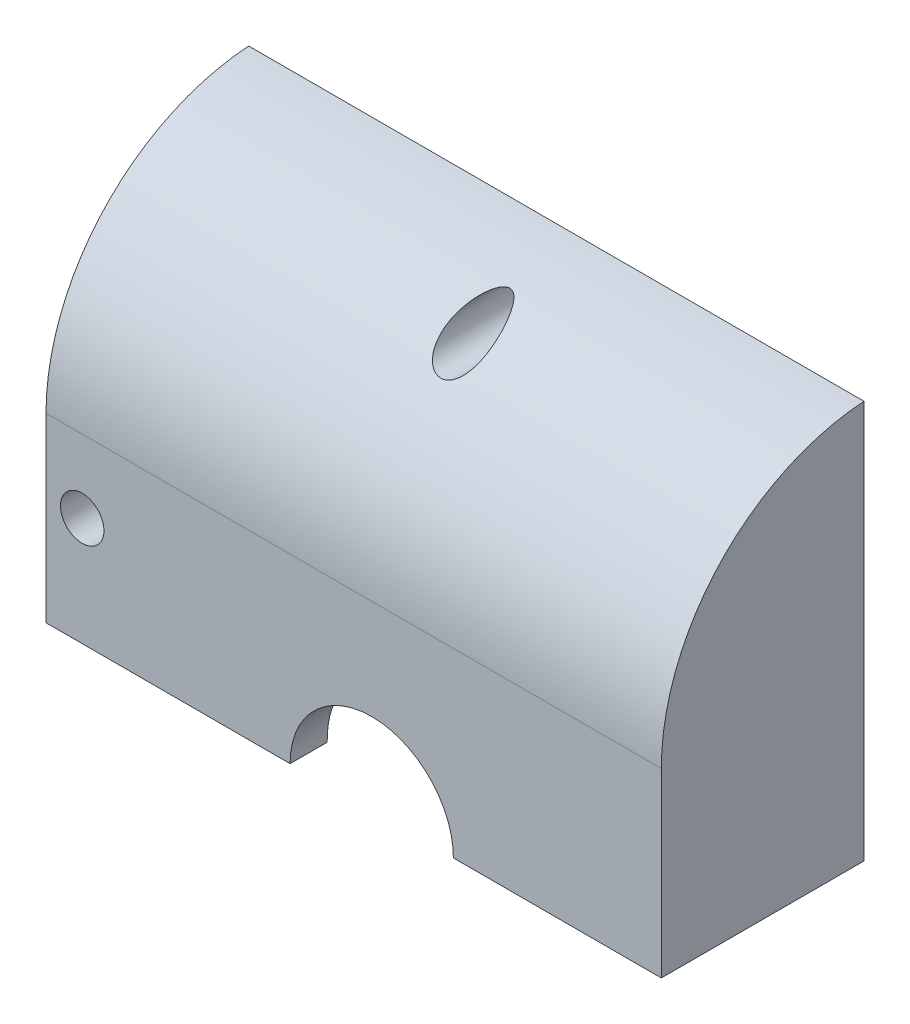
ISO-10303-21;
HEADER;
FILE_DESCRIPTION(('STEP AP214'),'2;1');
FILE_NAME('part.step','',(''),(''),'','','');
FILE_SCHEMA(('AUTOMOTIVE_DESIGN { 1 0 10303 214 1 1 1 1 }'));
ENDSEC;
DATA;
#1=APPLICATION_CONTEXT('core data for automotive mechanical design processes');
#2=APPLICATION_PROTOCOL_DEFINITION('international standard','automotive_design',2000,#1);
#3=PRODUCT_CONTEXT('',#1,'mechanical');
#4=PRODUCT('Part','Part','',(#3));
#5=PRODUCT_RELATED_PRODUCT_CATEGORY('part','',(#4));
#6=PRODUCT_DEFINITION_FORMATION('','',#4);
#7=PRODUCT_DEFINITION_CONTEXT('part definition',#1,'design');
#8=PRODUCT_DEFINITION('design','',#6,#7);
#9=PRODUCT_DEFINITION_SHAPE('','',#8);
#10=(LENGTH_UNIT() NAMED_UNIT(*) SI_UNIT(.MILLI.,.METRE.));
#11=(NAMED_UNIT(*) PLANE_ANGLE_UNIT() SI_UNIT($,.RADIAN.));
#12=(NAMED_UNIT(*) SI_UNIT($,.STERADIAN.) SOLID_ANGLE_UNIT());
#13=UNCERTAINTY_MEASURE_WITH_UNIT(LENGTH_MEASURE(1.E-05),#10,'distance_accuracy_value','');
#14=(GEOMETRIC_REPRESENTATION_CONTEXT(3) GLOBAL_UNCERTAINTY_ASSIGNED_CONTEXT((#13)) GLOBAL_UNIT_ASSIGNED_CONTEXT((#10,
#11,#12)) REPRESENTATION_CONTEXT('',''));
#15=CARTESIAN_POINT('',(0.,0.,0.));
#16=DIRECTION('',(0.,0.,1.));
#17=DIRECTION('',(1.,0.,0.));
#18=AXIS2_PLACEMENT_3D('',#15,#16,#17);
#19=CARTESIAN_POINT('',(0.,0.,25.5));
#20=DIRECTION('',(0.,0.,-1.));
#21=DIRECTION('',(-1.,0.,0.));
#22=AXIS2_PLACEMENT_3D('',#19,#20,#21);
#23=PLANE('',#22);
#24=CARTESIAN_POINT('',(45.0002335495647,55.0002335495648,25.5));
#25=DIRECTION('',(0.,0.,-1.));
#26=DIRECTION('',(-1.,0.,0.));
#27=AXIS2_PLACEMENT_3D('',#24,#25,#26);
#28=CIRCLE('',#27,11.28);
#29=CARTESIAN_POINT('',(40.9202335495647,65.516506653664,25.5));
#30=VERTEX_POINT('',#29);
#31=CARTESIAN_POINT('',(42.8830772732052,66.0797664504352,25.5));
#32=VERTEX_POINT('',#31);
#33=EDGE_CURVE('E325',#30,#32,#28,.T.);
#34=ORIENTED_EDGE('',*,*,#33,.F.);
#35=DIRECTION('',(0.,1.,0.));
#36=VECTOR('',#35,1.);
#37=CARTESIAN_POINT('',(40.9202335495647,0.,25.5));
#38=LINE('',#37,#36);
#39=CARTESIAN_POINT('',(40.9202335495647,66.0797664504352,25.5));
#40=VERTEX_POINT('',#39);
#41=EDGE_CURVE('E239',#30,#40,#38,.T.);
#42=ORIENTED_EDGE('',*,*,#41,.T.);
#43=DIRECTION('',(1.,0.,0.));
#44=VECTOR('',#43,1.);
#45=CARTESIAN_POINT('',(0.,66.0797664504352,25.5));
#46=LINE('',#45,#44);
#47=EDGE_CURVE('E240',#40,#32,#46,.T.);
#48=ORIENTED_EDGE('',*,*,#47,.T.);
#49=EDGE_LOOP('',(#34,#42,#48));
#50=FACE_BOUND('',#49,.T.);
#51=ADVANCED_FACE('F38',(#50),#23,.T.);
#52=CARTESIAN_POINT('',(47.1173898259243,66.0797664504352,25.5));
#53=VERTEX_POINT('',#52);
#54=CARTESIAN_POINT('',(49.0797664504352,65.5166878622462,25.5));
#55=VERTEX_POINT('',#54);
#56=EDGE_CURVE('E309',#53,#55,#28,.T.);
#57=ORIENTED_EDGE('',*,*,#56,.F.);
#58=CARTESIAN_POINT('',(49.0797664504352,66.0797664504352,25.5));
#59=VERTEX_POINT('',#58);
#60=EDGE_CURVE('E229',#53,#59,#46,.T.);
#61=ORIENTED_EDGE('',*,*,#60,.T.);
#62=DIRECTION('',(0.,-1.,0.));
#63=VECTOR('',#62,1.);
#64=CARTESIAN_POINT('',(49.0797664504352,0.,25.5));
#65=LINE('',#64,#63);
#66=EDGE_CURVE('E244',#59,#55,#65,.T.);
#67=ORIENTED_EDGE('',*,*,#66,.T.);
#68=EDGE_LOOP('',(#57,#61,#67));
#69=FACE_BOUND('',#68,.T.);
#70=ADVANCED_FACE('F361',(#69),#23,.T.);
#71=CARTESIAN_POINT('',(0.,0.,0.));
#72=DIRECTION('',(0.,0.,-1.));
#73=DIRECTION('',(-1.,0.,0.));
#74=AXIS2_PLACEMENT_3D('',#71,#72,#73);
#75=PLANE('',#74);
#76=DIRECTION('',(0.,1.,0.));
#77=VECTOR('',#76,1.);
#78=CARTESIAN_POINT('',(85.,55.,0.));
#79=LINE('',#78,#77);
#80=CARTESIAN_POINT('',(85.,55.,0.));
#81=VERTEX_POINT('',#80);
#82=CARTESIAN_POINT('',(85.,110.,0.));
#83=VERTEX_POINT('',#82);
#84=EDGE_CURVE('E164',#81,#83,#79,.T.);
#85=ORIENTED_EDGE('',*,*,#84,.F.);
#86=DIRECTION('',(1.,0.,0.));
#87=VECTOR('',#86,1.);
#88=CARTESIAN_POINT('',(90.,55.,0.));
#89=LINE('',#88,#87);
#90=CARTESIAN_POINT('',(77.8290960636936,55.,0.));
#91=VERTEX_POINT('',#90);
#92=EDGE_CURVE('E178',#91,#81,#89,.T.);
#93=ORIENTED_EDGE('',*,*,#92,.F.);
#94=DIRECTION('',(0.,1.,0.));
#95=VECTOR('',#94,1.);
#96=CARTESIAN_POINT('',(77.8290960636935,0.,0.));
#97=LINE('',#96,#95);
#98=CARTESIAN_POINT('',(77.8290960636935,75.5105795379122,0.));
#99=VERTEX_POINT('',#98);
#100=EDGE_CURVE('E260',#99,#91,#97,.F.);
#101=ORIENTED_EDGE('',*,*,#100,.F.);
#102=CARTESIAN_POINT('',(57.1235724554919,74.1235724554919,0.));
#103=DIRECTION('',(0.,0.,-1.));
#104=DIRECTION('',(-0.707106781186548,-0.707106781186548,0.));
#105=AXIS2_PLACEMENT_3D('',#102,#103,#104);
#106=ELLIPSE('',#105,21.3877866030965,20.);
#107=CARTESIAN_POINT('',(58.5105795379122,94.8290960636936,0.));
#108=VERTEX_POINT('',#107);
#109=EDGE_CURVE('E437',#99,#108,#106,.F.);
#110=ORIENTED_EDGE('',*,*,#109,.T.);
#111=DIRECTION('',(-1.,0.,0.));
#112=VECTOR('',#111,1.);
#113=CARTESIAN_POINT('',(0.,94.8290960636936,0.));
#114=LINE('',#113,#112);
#115=CARTESIAN_POINT('',(31.4894204620877,94.8290960636936,0.));
#116=VERTEX_POINT('',#115);
#117=EDGE_CURVE('E266',#116,#108,#114,.F.);
#118=ORIENTED_EDGE('',*,*,#117,.F.);
#119=CARTESIAN_POINT('',(32.876427544508,74.123572455492,0.));
#120=DIRECTION('',(0.,0.,-1.));
#121=DIRECTION('',(0.707106781186548,-0.707106781186548,0.));
#122=AXIS2_PLACEMENT_3D('',#119,#120,#121);
#123=ELLIPSE('',#122,21.3877866030965,20.);
#124=CARTESIAN_POINT('',(12.1709039363064,75.5105795379122,0.));
#125=VERTEX_POINT('',#124);
#126=EDGE_CURVE('E443',#116,#125,#123,.F.);
#127=ORIENTED_EDGE('',*,*,#126,.T.);
#128=DIRECTION('',(0.,-1.,0.));
#129=VECTOR('',#128,1.);
#130=CARTESIAN_POINT('',(12.1709039363064,0.,0.));
#131=LINE('',#130,#129);
#132=CARTESIAN_POINT('',(12.1709039363064,58.5,0.));
#133=VERTEX_POINT('',#132);
#134=EDGE_CURVE('E263',#133,#125,#131,.F.);
#135=ORIENTED_EDGE('',*,*,#134,.F.);
#136=DIRECTION('',(-1.,0.,0.));
#137=VECTOR('',#136,1.);
#138=CARTESIAN_POINT('',(12.1709039363064,58.5,0.));
#139=LINE('',#138,#137);
#140=CARTESIAN_POINT('',(0.,58.5,0.));
#141=VERTEX_POINT('',#140);
#142=EDGE_CURVE('E194',#133,#141,#139,.T.);
#143=ORIENTED_EDGE('',*,*,#142,.T.);
#144=DIRECTION('',(0.,-1.,0.));
#145=VECTOR('',#144,1.);
#146=CARTESIAN_POINT('',(0.,0.,0.));
#147=LINE('',#146,#145);
#148=CARTESIAN_POINT('',(0.,110.,0.));
#149=VERTEX_POINT('',#148);
#150=EDGE_CURVE('E287',#149,#141,#147,.T.);
#151=ORIENTED_EDGE('',*,*,#150,.F.);
#152=DIRECTION('',(-1.,0.,0.));
#153=VECTOR('',#152,1.);
#154=CARTESIAN_POINT('',(0.,110.,0.));
#155=LINE('',#154,#153);
#156=EDGE_CURVE('E181',#83,#149,#155,.T.);
#157=ORIENTED_EDGE('',*,*,#156,.F.);
#158=EDGE_LOOP('',(#85,#93,#101,#110,#118,#127,#135,#143,#151,#157));
#159=FACE_BOUND('',#158,.T.);
#160=CARTESIAN_POINT('',(45.,105.,0.));
#161=DIRECTION('',(0.,0.,-1.));
#162=DIRECTION('',(-1.,0.,0.));
#163=AXIS2_PLACEMENT_3D('',#160,#161,#162);
#164=CIRCLE('',#163,1.5);
#165=CARTESIAN_POINT('',(43.5,105.,0.));
#166=VERTEX_POINT('',#165);
#167=EDGE_CURVE('E283',#166,#166,#164,.T.);
#168=ORIENTED_EDGE('',*,*,#167,.F.);
#169=EDGE_LOOP('',(#168));
#170=FACE_BOUND('',#169,.T.);
#171=CARTESIAN_POINT('',(4.99999999999999,70.,0.));
#172=DIRECTION('',(0.,0.,-1.));
#173=DIRECTION('',(-1.,0.,0.));
#174=AXIS2_PLACEMENT_3D('',#171,#172,#173);
#175=CIRCLE('',#174,1.5);
#176=CARTESIAN_POINT('',(3.49999999999999,70.,0.));
#177=VERTEX_POINT('',#176);
#178=EDGE_CURVE('E288',#177,#177,#175,.T.);
#179=ORIENTED_EDGE('',*,*,#178,.F.);
#180=EDGE_LOOP('',(#179));
#181=FACE_BOUND('',#180,.T.);
#182=ADVANCED_FACE('F175',(#159,#170,#181),#75,.T.);
#183=CARTESIAN_POINT('',(45.,105.,28.));
#184=DIRECTION('',(0.,0.,-1.));
#185=DIRECTION('',(-1.,0.,0.));
#186=AXIS2_PLACEMENT_3D('',#183,#184,#185);
#187=CYLINDRICAL_SURFACE('',#186,1.5);
#188=ORIENTED_EDGE('',*,*,#167,.T.);
#189=EDGE_LOOP('',(#188));
#190=FACE_BOUND('',#189,.T.);
#191=CARTESIAN_POINT('',(45.,105.,2.));
#192=DIRECTION('',(0.,0.,1.));
#193=DIRECTION('',(1.,0.,0.));
#194=AXIS2_PLACEMENT_3D('',#191,#192,#193);
#195=CIRCLE('',#194,1.5);
#196=CARTESIAN_POINT('',(46.5,105.,2.));
#197=VERTEX_POINT('',#196);
#198=EDGE_CURVE('E313',#197,#197,#195,.F.);
#199=ORIENTED_EDGE('',*,*,#198,.F.);
#200=EDGE_LOOP('',(#199));
#201=FACE_BOUND('',#200,.T.);
#202=ADVANCED_FACE('F347',(#190,#201),#187,.F.);
#203=CARTESIAN_POINT('',(4.99999999999999,70.,28.));
#204=DIRECTION('',(0.,0.,-1.));
#205=DIRECTION('',(-1.,0.,0.));
#206=AXIS2_PLACEMENT_3D('',#203,#204,#205);
#207=CYLINDRICAL_SURFACE('',#206,1.5);
#208=ORIENTED_EDGE('',*,*,#178,.T.);
#209=EDGE_LOOP('',(#208));
#210=FACE_BOUND('',#209,.T.);
#211=CARTESIAN_POINT('',(4.99999999999999,70.,2.));
#212=DIRECTION('',(0.,0.,1.));
#213=DIRECTION('',(1.,0.,0.));
#214=AXIS2_PLACEMENT_3D('',#211,#212,#213);
#215=CIRCLE('',#214,1.5);
#216=CARTESIAN_POINT('',(6.49999999999999,70.,2.));
#217=VERTEX_POINT('',#216);
#218=EDGE_CURVE('E275',#217,#217,#215,.F.);
#219=ORIENTED_EDGE('',*,*,#218,.F.);
#220=EDGE_LOOP('',(#219));
#221=FACE_BOUND('',#220,.T.);
#222=ADVANCED_FACE('F350',(#210,#221),#207,.F.);
#223=CARTESIAN_POINT('',(0.,0.,28.));
#224=DIRECTION('',(1.,0.,0.));
#225=DIRECTION('',(0.,1.,0.));
#226=AXIS2_PLACEMENT_3D('',#223,#224,#225);
#227=PLANE('',#226);
#228=DIRECTION('',(0.,0.,-1.));
#229=VECTOR('',#228,1.);
#230=CARTESIAN_POINT('',(0.,58.5,6.5));
#231=LINE('',#230,#229);
#232=CARTESIAN_POINT('',(0.,58.5,6.5));
#233=VERTEX_POINT('',#232);
#234=EDGE_CURVE('E463',#233,#141,#231,.T.);
#235=ORIENTED_EDGE('',*,*,#234,.F.);
#236=CARTESIAN_POINT('',(0.,55.,6.5));
#237=DIRECTION('',(-1.,0.,0.));
#238=DIRECTION('',(0.,-1.,0.));
#239=AXIS2_PLACEMENT_3D('',#236,#237,#238);
#240=CIRCLE('',#239,3.5);
#241=CARTESIAN_POINT('',(0.,55.,10.));
#242=VERTEX_POINT('',#241);
#243=EDGE_CURVE('E462',#242,#233,#240,.T.);
#244=ORIENTED_EDGE('',*,*,#243,.F.);
#245=DIRECTION('',(0.,0.,-1.));
#246=VECTOR('',#245,1.);
#247=CARTESIAN_POINT('',(0.,55.,28.));
#248=LINE('',#247,#246);
#249=CARTESIAN_POINT('',(0.,55.,28.));
#250=VERTEX_POINT('',#249);
#251=EDGE_CURVE('E197',#250,#242,#248,.T.);
#252=ORIENTED_EDGE('',*,*,#251,.F.);
#253=DIRECTION('',(0.,-1.,0.));
#254=VECTOR('',#253,1.);
#255=CARTESIAN_POINT('',(0.,0.,28.));
#256=LINE('',#255,#254);
#257=CARTESIAN_POINT('',(0.,80.0667409058085,28.));
#258=VERTEX_POINT('',#257);
#259=EDGE_CURVE('E293',#258,#250,#256,.T.);
#260=ORIENTED_EDGE('',*,*,#259,.F.);
#261=CARTESIAN_POINT('',(0.,80.0667409058085,-2.));
#262=DIRECTION('',(1.,0.,0.));
#263=DIRECTION('',(0.,1.,0.));
#264=AXIS2_PLACEMENT_3D('',#261,#262,#263);
#265=CIRCLE('',#264,30.);
#266=EDGE_CURVE('E305',#258,#149,#265,.F.);
#267=ORIENTED_EDGE('',*,*,#266,.T.);
#268=ORIENTED_EDGE('',*,*,#150,.T.);
#269=EDGE_LOOP('',(#235,#244,#252,#260,#267,#268));
#270=FACE_BOUND('',#269,.T.);
#271=ADVANCED_FACE('F354',(#270),#227,.F.);
#272=CARTESIAN_POINT('',(0.,0.,28.));
#273=DIRECTION('',(0.,0.,-1.));
#274=DIRECTION('',(-1.,0.,0.));
#275=AXIS2_PLACEMENT_3D('',#272,#273,#274);
#276=PLANE('',#275);
#277=DIRECTION('',(1.,0.,0.));
#278=VECTOR('',#277,1.);
#279=CARTESIAN_POINT('',(90.,55.,28.));
#280=LINE('',#279,#278);
#281=CARTESIAN_POINT('',(56.2802335471469,55.,28.));
#282=VERTEX_POINT('',#281);
#283=CARTESIAN_POINT('',(85.,55.,28.));
#284=VERTEX_POINT('',#283);
#285=EDGE_CURVE('E188',#282,#284,#280,.T.);
#286=ORIENTED_EDGE('',*,*,#285,.T.);
#287=DIRECTION('',(0.,1.,0.));
#288=VECTOR('',#287,1.);
#289=CARTESIAN_POINT('',(85.,55.,28.));
#290=LINE('',#289,#288);
#291=CARTESIAN_POINT('',(85.,80.0667409058085,28.));
#292=VERTEX_POINT('',#291);
#293=EDGE_CURVE('E54',#284,#292,#290,.T.);
#294=ORIENTED_EDGE('',*,*,#293,.T.);
#295=DIRECTION('',(1.,0.,0.));
#296=VECTOR('',#295,1.);
#297=CARTESIAN_POINT('',(0.,80.0667409058085,28.));
#298=LINE('',#297,#296);
#299=EDGE_CURVE('E297',#292,#258,#298,.F.);
#300=ORIENTED_EDGE('',*,*,#299,.T.);
#301=ORIENTED_EDGE('',*,*,#259,.T.);
#302=CARTESIAN_POINT('',(33.7202335519825,55.,28.));
#303=VERTEX_POINT('',#302);
#304=EDGE_CURVE('E192',#250,#303,#280,.T.);
#305=ORIENTED_EDGE('',*,*,#304,.T.);
#306=CARTESIAN_POINT('',(45.0002335495647,55.0002335495648,28.));
#307=DIRECTION('',(0.,0.,-1.));
#308=DIRECTION('',(-1.,0.,0.));
#309=AXIS2_PLACEMENT_3D('',#306,#307,#308);
#310=CIRCLE('',#309,11.28);
#311=EDGE_CURVE('E225',#303,#282,#310,.T.);
#312=ORIENTED_EDGE('',*,*,#311,.T.);
#313=EDGE_LOOP('',(#286,#294,#300,#301,#305,#312));
#314=FACE_BOUND('',#313,.T.);
#315=CARTESIAN_POINT('',(4.99999999999999,70.,28.));
#316=DIRECTION('',(0.,0.,1.));
#317=DIRECTION('',(1.,0.,0.));
#318=AXIS2_PLACEMENT_3D('',#315,#316,#317);
#319=CIRCLE('',#318,3.);
#320=CARTESIAN_POINT('',(7.99999999999999,70.,28.));
#321=VERTEX_POINT('',#320);
#322=EDGE_CURVE('E270',#321,#321,#319,.T.);
#323=ORIENTED_EDGE('',*,*,#322,.F.);
#324=EDGE_LOOP('',(#323));
#325=FACE_BOUND('',#324,.T.);
#326=ADVANCED_FACE('F356',(#314,#325),#276,.F.);
#327=CARTESIAN_POINT('',(0.,80.0667409058085,-2.));
#328=DIRECTION('',(1.,0.,0.));
#329=DIRECTION('',(0.,0.,-1.));
#330=AXIS2_PLACEMENT_3D('',#327,#328,#329);
#331=CYLINDRICAL_SURFACE('',#330,30.);
#332=CARTESIAN_POINT('',(85.,80.0667409058085,-2.));
#333=DIRECTION('',(-1.,0.,0.));
#334=DIRECTION('',(0.,0.,1.));
#335=AXIS2_PLACEMENT_3D('',#332,#333,#334);
#336=CIRCLE('',#335,30.);
#337=EDGE_CURVE('E170',#83,#292,#336,.F.);
#338=ORIENTED_EDGE('',*,*,#337,.F.);
#339=ORIENTED_EDGE('',*,*,#156,.T.);
#340=ORIENTED_EDGE('',*,*,#266,.F.);
#341=ORIENTED_EDGE('',*,*,#299,.F.);
#342=EDGE_LOOP('',(#338,#339,#340,#341));
#343=FACE_BOUND('',#342,.T.);
#344=CARTESIAN_POINT('',(48.,105.,14.6833027588039));
#345=CARTESIAN_POINT('',(48.000002591623,105.141031079127,14.4725298812524));
#346=CARTESIAN_POINT('',(47.9900835111816,105.279392293057,14.2599551503215));
#347=CARTESIAN_POINT('',(47.9523148630738,105.550006022166,13.8324746407863));
#348=CARTESIAN_POINT('',(47.9244584276033,105.682256176766,13.6175680003454));
#349=CARTESIAN_POINT('',(47.8520278222401,105.940151481423,13.1864985360771));
#350=CARTESIAN_POINT('',(47.8074461947228,106.065793656499,12.9703351942904));
#351=CARTESIAN_POINT('',(47.7021531464668,106.30998308035,12.538013132471));
#352=CARTESIAN_POINT('',(47.6414472882712,106.42853275865,12.3218544365053));
#353=CARTESIAN_POINT('',(47.5270208950587,106.619255009804,11.9638848367375));
#354=CARTESIAN_POINT('',(47.4779058645433,106.693528407813,11.8217051858609));
#355=CARTESIAN_POINT('',(47.3721956873543,106.838682647495,11.538406567637));
#356=CARTESIAN_POINT('',(47.3156014818441,106.909563914501,11.3972874691896));
#357=CARTESIAN_POINT('',(47.1944471152186,107.047639853017,11.1169908524173));
#358=CARTESIAN_POINT('',(47.1299004804887,107.114840511123,10.9778104734387));
#359=CARTESIAN_POINT('',(46.9918184469083,107.245369699676,10.7021803194175));
#360=CARTESIAN_POINT('',(46.9182866338817,107.308699759769,10.5657294802002));
#361=CARTESIAN_POINT('',(46.7572829685716,107.433684607443,10.2912171335147));
#362=CARTESIAN_POINT('',(46.6693507949835,107.495153174878,10.1533345304262));
#363=CARTESIAN_POINT('',(46.5266758149802,107.583091818098,9.95223080536598));
#364=CARTESIAN_POINT('',(46.4773047148091,107.61170204868,9.88613036417895));
#365=CARTESIAN_POINT('',(46.3744347387842,107.667273428867,9.75651179671982));
#366=CARTESIAN_POINT('',(46.3209370480073,107.694235047963,9.69299293700945));
#367=CARTESIAN_POINT('',(46.1875568143109,107.756273487063,9.54549260136074));
#368=CARTESIAN_POINT('',(46.1054696194529,107.790457980019,9.46309376078717));
#369=CARTESIAN_POINT('',(45.9300453631038,107.853714131567,9.30889040113238));
#370=CARTESIAN_POINT('',(45.8367348014824,107.882797450199,9.23706178329742));
#371=CARTESIAN_POINT('',(45.6745957557979,107.923871883289,9.13472411314338));
#372=CARTESIAN_POINT('',(45.6097897390059,107.93817422138,9.09884373822366));
#373=CARTESIAN_POINT('',(45.4750944976128,107.962929595298,9.03647500593124));
#374=CARTESIAN_POINT('',(45.4052139565322,107.973389029489,9.0099710397673));
#375=CARTESIAN_POINT('',(45.2724521666953,107.988229373154,8.97227573297246));
#376=CARTESIAN_POINT('',(45.2101477618363,107.993297816738,8.95935607417621));
#377=CARTESIAN_POINT('',(45.0840865108296,107.999483358226,8.94358151039204));
#378=CARTESIAN_POINT('',(45.0203308255335,108.000603509749,8.94071882732264));
#379=CARTESIAN_POINT('',(44.893264105949,107.998774305054,8.94538781046502));
#380=CARTESIAN_POINT('',(44.8299531327714,107.995824400126,8.95292087819236));
#381=CARTESIAN_POINT('',(44.7055111504433,107.986165786894,8.97751715513842));
#382=CARTESIAN_POINT('',(44.6443823958158,107.979453304438,8.99458993335927));
#383=CARTESIAN_POINT('',(44.5019819800649,107.959559006135,9.04498442920333));
#384=CARTESIAN_POINT('',(44.4222661138487,107.944870177575,9.08205818992003));
#385=CARTESIAN_POINT('',(44.2700019257307,107.910882321951,9.16717886081252));
#386=CARTESIAN_POINT('',(44.197473614584,107.89157090837,9.21525523774819));
#387=CARTESIAN_POINT('',(44.0663724545288,107.851758077368,9.31350257811135));
#388=CARTESIAN_POINT('',(44.0071326206595,107.83158890811,9.3629366035284));
#389=CARTESIAN_POINT('',(43.893394895941,107.789106360648,9.46619265667239));
#390=CARTESIAN_POINT('',(43.8389011172845,107.766791157562,9.52001841290969));
#391=CARTESIAN_POINT('',(43.7339918778672,107.720389502609,9.63096480159878));
#392=CARTESIAN_POINT('',(43.6835842675287,107.696299803376,9.68809143137577));
#393=CARTESIAN_POINT('',(43.5864172079278,107.646649574365,9.80477325298288));
#394=CARTESIAN_POINT('',(43.5396591897033,107.621088474396,9.86432938364355));
#395=CARTESIAN_POINT('',(43.3935204222532,107.536317855383,10.0600153313808));
#396=CARTESIAN_POINT('',(43.3005196984789,107.474563640762,10.1998181378718));
#397=CARTESIAN_POINT('',(43.1269944578655,107.345949278238,10.4847646803533));
#398=CARTESIAN_POINT('',(43.0464841422119,107.279083445624,10.6299142668687));
#399=CARTESIAN_POINT('',(42.8957636921329,107.140718291303,10.9238617581111));
#400=CARTESIAN_POINT('',(42.8255814858889,107.069207133566,11.0726683296294));
#401=CARTESIAN_POINT('',(42.6945313272728,106.92210979235,11.3722479454045));
#402=CARTESIAN_POINT('',(42.633660079384,106.84652506354,11.5230202733019));
#403=CARTESIAN_POINT('',(42.5295271516621,106.703894705417,11.8015378798166));
#404=CARTESIAN_POINT('',(42.485006312599,106.637418355525,11.9291068020029));
#405=CARTESIAN_POINT('',(42.4017653734958,106.501832543933,12.184741092047));
#406=CARTESIAN_POINT('',(42.363045834667,106.432722828295,12.3128065067071));
#407=CARTESIAN_POINT('',(42.2553647095737,106.221479625243,12.6974542648712));
#408=CARTESIAN_POINT('',(42.1949241495583,106.075492231879,12.9543703907876));
#409=CARTESIAN_POINT('',(42.0973194615085,105.774242115619,13.4664978357001));
#410=CARTESIAN_POINT('',(42.0601131143682,105.618996781297,13.7217114083104));
#411=CARTESIAN_POINT('',(42.0106592630321,105.299839339095,14.2289973158428));
#412=CARTESIAN_POINT('',(41.9983921586686,105.135934141179,14.4810719627134));
#413=CARTESIAN_POINT('',(42.0012075244702,104.870095294079,14.8767509487081));
#414=CARTESIAN_POINT('',(42.0070741382572,104.770579539647,15.0220826646848));
#415=CARTESIAN_POINT('',(42.0293386899602,104.569399216471,15.3104188239733));
#416=CARTESIAN_POINT('',(42.0457339207564,104.467735206583,15.453423855834));
#417=CARTESIAN_POINT('',(42.0900808830748,104.262882267823,15.7363247281546));
#418=CARTESIAN_POINT('',(42.1180210362387,104.159694966348,15.8762235361314));
#419=CARTESIAN_POINT('',(42.1867117789203,103.952467198427,16.1521851379296));
#420=CARTESIAN_POINT('',(42.2274582538967,103.848427016446,16.2882491485538));
#421=CARTESIAN_POINT('',(42.3093730915801,103.670667072147,16.5167254489872));
#422=CARTESIAN_POINT('',(42.3469990403942,103.596895794201,16.6103635888019));
#423=CARTESIAN_POINT('',(42.4300602219743,103.449988892636,16.7946177731957));
#424=CARTESIAN_POINT('',(42.4754970236026,103.376853399824,16.8852332062694));
#425=CARTESIAN_POINT('',(42.6244150629429,103.159501474211,17.1514067837195));
#426=CARTESIAN_POINT('',(42.7406502642476,103.017003828139,17.3217222485948));
#427=CARTESIAN_POINT('',(42.9702781822597,102.786881425236,17.5912343995113));
#428=CARTESIAN_POINT('',(43.0735317189483,102.695868036776,17.6961846944635));
#429=CARTESIAN_POINT('',(43.3001295787192,102.523999348177,17.8919175113872));
#430=CARTESIAN_POINT('',(43.4234441759407,102.443129327216,17.9827206123243));
#431=CARTESIAN_POINT('',(43.6618299749454,102.312310893604,18.1281423684601));
#432=CARTESIAN_POINT('',(43.773097004995,102.259442453433,18.1863505670001));
#433=CARTESIAN_POINT('',(44.0071481731233,102.166269375744,18.2883126194018));
#434=CARTESIAN_POINT('',(44.1299262678138,102.1259581931,18.3320740039804));
#435=CARTESIAN_POINT('',(44.321118881865,102.077068206865,18.3849471514803));
#436=CARTESIAN_POINT('',(44.3863523515522,102.062660013825,18.4004868988974));
#437=CARTESIAN_POINT('',(44.5185329968106,102.038126147864,18.4269076810907));
#438=CARTESIAN_POINT('',(44.5854792798108,102.027998290736,18.4377910919772));
#439=CARTESIAN_POINT('',(44.7204900958188,102.012276758068,18.4546716319166));
#440=CARTESIAN_POINT('',(44.7885541982752,102.006681376688,18.4606705992803));
#441=CARTESIAN_POINT('',(44.9251376497687,102.000153546349,18.4676678322487));
#442=CARTESIAN_POINT('',(44.9936569371081,101.999220477851,18.4686667622691));
#443=CARTESIAN_POINT('',(45.1804357412615,102.003101956344,18.464508797215));
#444=CARTESIAN_POINT('',(45.2985542975517,102.012600632353,18.4543353112001));
#445=CARTESIAN_POINT('',(45.530649800474,102.044973889254,18.4195448529611));
#446=CARTESIAN_POINT('',(45.6446266568329,102.067848761511,18.3949275661176));
#447=CARTESIAN_POINT('',(45.8658444274519,102.125389911566,18.3326776334174));
#448=CARTESIAN_POINT('',(45.9730821742814,102.160061685608,18.295038920665));
#449=CARTESIAN_POINT('',(46.1790271114008,102.239186075058,18.208565424553));
#450=CARTESIAN_POINT('',(46.2777306007301,102.283642904508,18.1597258170213));
#451=CARTESIAN_POINT('',(46.5115863521084,102.40388584605,18.0265661562815));
#452=CARTESIAN_POINT('',(46.6410839530114,102.48438637815,17.9365495175136));
#453=CARTESIAN_POINT('',(46.8790893303172,102.656768026396,17.7410185582575));
#454=CARTESIAN_POINT('',(46.9875468642207,102.748675544861,17.6354681748798));
#455=CARTESIAN_POINT('',(47.230335500705,102.983595478396,17.3613875924246));
#456=CARTESIAN_POINT('',(47.3534345962118,103.130584867442,17.1863065512469));
#457=CARTESIAN_POINT('',(47.5105587123753,103.355173573371,16.9119849150749));
#458=CARTESIAN_POINT('',(47.5583877928222,103.43081610551,16.8184721703241));
#459=CARTESIAN_POINT('',(47.6456197255515,103.582830641516,16.628158327797));
#460=CARTESIAN_POINT('',(47.6850245720796,103.659202468257,16.5313580145797));
#461=CARTESIAN_POINT('',(47.770500581608,103.843113691302,16.2952096593042));
#462=CARTESIAN_POINT('',(47.8127817323857,103.950716833738,16.1545451230666));
#463=CARTESIAN_POINT('',(47.8836647865241,104.165006897858,15.8691201589684));
#464=CARTESIAN_POINT('',(47.9122617267839,104.271693473358,15.7243582651757));
#465=CARTESIAN_POINT('',(47.9571672381932,104.483395431431,15.4315704485512));
#466=CARTESIAN_POINT('',(47.9734647926381,104.588409233474,15.2835417214166));
#467=CARTESIAN_POINT('',(47.9948799832521,104.796074205838,14.9850858943339));
#468=CARTESIAN_POINT('',(47.9999981389537,104.898725485732,14.8346589061657));
#469=CARTESIAN_POINT('',(48.,105.,14.6833027588039));
#470=B_SPLINE_CURVE_WITH_KNOTS('',3,(#344,#345,#346,#347,#348,#349,#350,#351,#352,#353,#354,
#355,#356,#357,#358,#359,#360,#361,#362,#363,#364,#365,#366,#367,#368,#369,#370,#371,#372,#373,
#374,#375,#376,#377,#378,#379,#380,#381,#382,#383,#384,#385,#386,#387,#388,#389,#390,#391,#392,
#393,#394,#395,#396,#397,#398,#399,#400,#401,#402,#403,#404,#405,#406,#407,#408,#409,#410,#411,
#412,#413,#414,#415,#416,#417,#418,#419,#420,#421,#422,#423,#424,#425,#426,#427,#428,#429,#430,
#431,#432,#433,#434,#435,#436,#437,#438,#439,#440,#441,#442,#443,#444,#445,#446,#447,#448,#449,
#450,#451,#452,#453,#454,#455,#456,#457,#458,#459,#460,#461,#462,#463,#464,#465,#466,#467,#468,
#469),.UNSPECIFIED.,.T.,.F.,(4,2,2,2,2,2,2,2,2,2,2,2,2,2,2,2,2,2,2,2,2,2,2,2,2,2,2,2,2,2,2,2,2,
2,2,2,2,2,2,2,2,2,2,2,2,2,2,2,2,2,2,2,2,2,2,2,2,2,2,2,2,2,4),(0.,0.7606654765522,
1.52162236787567,2.28291896763278,3.04395327534952,3.54706040617038,4.05010428724253,
4.55230405078276,5.05430404595241,5.57768389289947,5.83953311409624,6.10130741524021,
6.46428349650863,6.82641877302855,7.05210744418303,7.27741862648722,7.46807150966826,
7.65857690909742,7.84910799424892,8.03983053948295,8.30571625104681,8.57232255727478,
8.81122150012662,9.05032541804628,9.28987832556647,9.52952469693579,10.0653347127162,
10.6017495315269,11.1395892157661,11.6772380945608,12.1288436993068,12.5804929637085,
13.4842077820331,14.3862756364551,15.2876342661827,15.8160576489288,16.3443452177312,
16.8721042499669,17.39969389162,17.7744298217501,18.1492411082491,18.8971826029858,
19.41488728415,19.9318317191508,20.3390722565256,20.7461001744565,20.9516049554324,
21.1570047426779,21.3623271898052,21.5676223525139,21.9225270414955,22.2774394614079,
22.6325174640266,22.9877486852149,23.5159525455595,24.0454026066733,24.8197147032942,
25.2078261796233,25.5958456774097,26.1414194631673,26.6871909723771,27.2334507572339,
27.7796851556036),.UNSPECIFIED.);
#471=CARTESIAN_POINT('',(48.,105.,14.6833027588039));
#472=VERTEX_POINT('',#471);
#473=EDGE_CURVE('E292',#472,#472,#470,.T.);
#474=ORIENTED_EDGE('',*,*,#473,.F.);
#475=EDGE_LOOP('',(#474));
#476=FACE_BOUND('',#475,.T.);
#477=ADVANCED_FACE('F327',(#343,#476),#331,.T.);
#478=CARTESIAN_POINT('',(4.99999999999999,70.,2.));
#479=DIRECTION('',(0.,0.,1.));
#480=DIRECTION('',(1.,0.,0.));
#481=AXIS2_PLACEMENT_3D('',#478,#479,#480);
#482=PLANE('',#481);
#483=CARTESIAN_POINT('',(4.99999999999999,70.,2.));
#484=DIRECTION('',(0.,0.,1.));
#485=DIRECTION('',(1.,0.,0.));
#486=AXIS2_PLACEMENT_3D('',#483,#484,#485);
#487=CIRCLE('',#486,3.);
#488=CARTESIAN_POINT('',(7.99999999999999,70.,2.));
#489=VERTEX_POINT('',#488);
#490=EDGE_CURVE('E276',#489,#489,#487,.T.);
#491=ORIENTED_EDGE('',*,*,#490,.T.);
#492=EDGE_LOOP('',(#491));
#493=FACE_BOUND('',#492,.T.);
#494=ORIENTED_EDGE('',*,*,#218,.T.);
#495=EDGE_LOOP('',(#494));
#496=FACE_BOUND('',#495,.T.);
#497=ADVANCED_FACE('F339',(#493,#496),#482,.T.);
#498=CARTESIAN_POINT('',(4.99999999999999,70.,2.));
#499=DIRECTION('',(0.,0.,1.));
#500=DIRECTION('',(1.,0.,0.));
#501=AXIS2_PLACEMENT_3D('',#498,#499,#500);
#502=CYLINDRICAL_SURFACE('',#501,3.);
#503=CARTESIAN_POINT('',(7.99999999999999,70.,2.));
#504=CARTESIAN_POINT('',(7.99999999999999,70.,2.27083333333333));
#505=CARTESIAN_POINT('',(7.99999999999999,70.,2.54166666666667));
#506=CARTESIAN_POINT('',(7.99999999999999,70.,3.08333333333334));
#507=CARTESIAN_POINT('',(7.99999999999999,70.,3.35416666666667));
#508=CARTESIAN_POINT('',(7.99999999999999,70.,3.89583333333333));
#509=CARTESIAN_POINT('',(7.99999999999999,70.,4.16666666666667));
#510=CARTESIAN_POINT('',(7.99999999999999,70.,4.70833333333333));
#511=CARTESIAN_POINT('',(7.99999999999999,70.,4.97916666666667));
#512=CARTESIAN_POINT('',(7.99999999999999,70.,5.52083333333333));
#513=CARTESIAN_POINT('',(7.99999999999999,70.,5.79166666666667));
#514=CARTESIAN_POINT('',(7.99999999999999,70.,6.33333333333333));
#515=CARTESIAN_POINT('',(7.99999999999999,70.,6.60416666666667));
#516=CARTESIAN_POINT('',(7.99999999999999,70.,7.14583333333333));
#517=CARTESIAN_POINT('',(7.99999999999999,70.,7.41666666666667));
#518=CARTESIAN_POINT('',(7.99999999999999,70.,7.95833333333333));
#519=CARTESIAN_POINT('',(7.99999999999999,70.,8.22916666666667));
#520=CARTESIAN_POINT('',(7.99999999999999,70.,8.77083333333333));
#521=CARTESIAN_POINT('',(7.99999999999999,70.,9.04166666666667));
#522=CARTESIAN_POINT('',(7.99999999999999,70.,9.58333333333333));
#523=CARTESIAN_POINT('',(7.99999999999999,70.,9.85416666666667));
#524=CARTESIAN_POINT('',(7.99999999999999,70.,10.3958333333333));
#525=CARTESIAN_POINT('',(7.99999999999999,70.,10.6666666666667));
#526=CARTESIAN_POINT('',(7.99999999999999,70.,11.2083333333333));
#527=CARTESIAN_POINT('',(7.99999999999999,70.,11.4791666666667));
#528=CARTESIAN_POINT('',(7.99999999999999,70.,12.0208333333333));
#529=CARTESIAN_POINT('',(7.99999999999999,70.,12.2916666666667));
#530=CARTESIAN_POINT('',(7.99999999999999,70.,12.8333333333333));
#531=CARTESIAN_POINT('',(7.99999999999999,70.,13.1041666666667));
#532=CARTESIAN_POINT('',(7.99999999999999,70.,13.6458333333333));
#533=CARTESIAN_POINT('',(7.99999999999999,70.,13.9166666666667));
#534=CARTESIAN_POINT('',(7.99999999999999,70.,14.4583333333333));
#535=CARTESIAN_POINT('',(7.99999999999999,70.,14.7291666666667));
#536=CARTESIAN_POINT('',(7.99999999999999,70.,15.2708333333333));
#537=CARTESIAN_POINT('',(7.99999999999999,70.,15.5416666666667));
#538=CARTESIAN_POINT('',(7.99999999999999,70.,16.0833333333333));
#539=CARTESIAN_POINT('',(7.99999999999999,70.,16.3541666666667));
#540=CARTESIAN_POINT('',(7.99999999999999,70.,16.8958333333333));
#541=CARTESIAN_POINT('',(7.99999999999999,70.,17.1666666666667));
#542=CARTESIAN_POINT('',(7.99999999999999,70.,17.7083333333333));
#543=CARTESIAN_POINT('',(7.99999999999999,70.,17.9791666666667));
#544=CARTESIAN_POINT('',(7.99999999999999,70.,18.5208333333333));
#545=CARTESIAN_POINT('',(7.99999999999999,70.,18.7916666666667));
#546=CARTESIAN_POINT('',(7.99999999999999,70.,19.3333333333333));
#547=CARTESIAN_POINT('',(7.99999999999999,70.,19.6041666666667));
#548=CARTESIAN_POINT('',(7.99999999999999,70.,20.1458333333333));
#549=CARTESIAN_POINT('',(7.99999999999999,70.,20.4166666666667));
#550=CARTESIAN_POINT('',(7.99999999999999,70.,20.9583333333333));
#551=CARTESIAN_POINT('',(7.99999999999999,70.,21.2291666666667));
#552=CARTESIAN_POINT('',(7.99999999999999,70.,21.7708333333333));
#553=CARTESIAN_POINT('',(7.99999999999999,70.,22.0416666666667));
#554=CARTESIAN_POINT('',(7.99999999999999,70.,22.5833333333333));
#555=CARTESIAN_POINT('',(7.99999999999999,70.,22.8541666666667));
#556=CARTESIAN_POINT('',(7.99999999999999,70.,23.3958333333333));
#557=CARTESIAN_POINT('',(7.99999999999999,70.,23.6666666666667));
#558=CARTESIAN_POINT('',(7.99999999999999,70.,24.2083333333333));
#559=CARTESIAN_POINT('',(7.99999999999999,70.,24.4791666666667));
#560=CARTESIAN_POINT('',(7.99999999999999,70.,25.0208333333333));
#561=CARTESIAN_POINT('',(7.99999999999999,70.,25.2916666666667));
#562=CARTESIAN_POINT('',(7.99999999999999,70.,25.8333333333333));
#563=CARTESIAN_POINT('',(7.99999999999999,70.,26.1041666666667));
#564=CARTESIAN_POINT('',(7.99999999999999,70.,26.6458333333333));
#565=CARTESIAN_POINT('',(7.99999999999999,70.,26.9166666666667));
#566=CARTESIAN_POINT('',(7.99999999999999,70.,27.4583333333333));
#567=CARTESIAN_POINT('',(7.99999999999999,70.,27.7291666666667));
#568=CARTESIAN_POINT('',(7.99999999999999,70.,28.));
#569=B_SPLINE_CURVE_WITH_KNOTS('',3,(#503,#504,#505,#506,#507,#508,#509,#510,#511,#512,#513,
#514,#515,#516,#517,#518,#519,#520,#521,#522,#523,#524,#525,#526,#527,#528,#529,#530,#531,#532,
#533,#534,#535,#536,#537,#538,#539,#540,#541,#542,#543,#544,#545,#546,#547,#548,#549,#550,#551,
#552,#553,#554,#555,#556,#557,#558,#559,#560,#561,#562,#563,#564,#565,#566,#567,#568),
.UNSPECIFIED.,.F.,.F.,(4,2,2,2,2,2,2,2,2,2,2,2,2,2,2,2,2,2,2,2,2,2,2,2,2,2,2,2,2,2,2,2,4),(0.,
0.8125,1.625,2.4375,3.25,4.0625,4.875,5.6875,6.5,7.3125,8.125,8.9375,9.75,10.5625,11.375,
12.1875,13.,13.8125,14.625,15.4375,16.25,17.0625,17.875,18.6875,19.5,20.3125,21.125,21.9375,
22.75,23.5625,24.375,25.1875,26.),.UNSPECIFIED.);
#570=EDGE_CURVE('BSEAM342',#489,#321,#569,.T.);
#571=ORIENTED_EDGE('',*,*,#490,.F.);
#572=ORIENTED_EDGE('',*,*,#322,.T.);
#573=ORIENTED_EDGE('',*,*,#570,.T.);
#574=ORIENTED_EDGE('',*,*,#570,.F.);
#575=EDGE_LOOP('',(#571,#573,#572,#574));
#576=FACE_BOUND('',#575,.T.);
#577=ADVANCED_FACE('F342',(#576),#502,.F.);
#578=CARTESIAN_POINT('',(45.,105.,2.));
#579=DIRECTION('',(0.,0.,1.));
#580=DIRECTION('',(1.,0.,0.));
#581=AXIS2_PLACEMENT_3D('',#578,#579,#580);
#582=PLANE('',#581);
#583=CARTESIAN_POINT('',(45.,105.,2.));
#584=DIRECTION('',(0.,0.,1.));
#585=DIRECTION('',(1.,0.,0.));
#586=AXIS2_PLACEMENT_3D('',#583,#584,#585);
#587=CIRCLE('',#586,3.);
#588=CARTESIAN_POINT('',(48.,105.,2.));
#589=VERTEX_POINT('',#588);
#590=EDGE_CURVE('E271',#589,#589,#587,.T.);
#591=ORIENTED_EDGE('',*,*,#590,.T.);
#592=EDGE_LOOP('',(#591));
#593=FACE_BOUND('',#592,.T.);
#594=ORIENTED_EDGE('',*,*,#198,.T.);
#595=EDGE_LOOP('',(#594));
#596=FACE_BOUND('',#595,.T.);
#597=ADVANCED_FACE('F336',(#593,#596),#582,.T.);
#598=CARTESIAN_POINT('',(45.,105.,2.));
#599=DIRECTION('',(0.,0.,1.));
#600=DIRECTION('',(1.,0.,0.));
#601=AXIS2_PLACEMENT_3D('',#598,#599,#600);
#602=CYLINDRICAL_SURFACE('',#601,3.);
#603=ORIENTED_EDGE('',*,*,#473,.T.);
#604=EDGE_LOOP('',(#603));
#605=FACE_BOUND('',#604,.T.);
#606=ORIENTED_EDGE('',*,*,#590,.F.);
#607=EDGE_LOOP('',(#606));
#608=FACE_BOUND('',#607,.T.);
#609=ADVANCED_FACE('F330',(#605,#608),#602,.F.);
#610=CARTESIAN_POINT('',(81.4999999999999,11.5,13.7));
#611=DIRECTION('',(0.965925826289068,0.,-0.258819045102521));
#612=DIRECTION('',(-0.258819045102521,0.,-0.965925826289068));
#613=AXIS2_PLACEMENT_3D('',#610,#611,#612);
#614=PLANE('',#613);
#615=DIRECTION('',(0.258819045102521,0.,0.965925826289068));
#616=VECTOR('',#615,1.);
#617=CARTESIAN_POINT('',(81.4999999999999,55.,13.7));
#618=LINE('',#617,#616);
#619=CARTESIAN_POINT('',(81.4999999999999,55.,13.7));
#620=VERTEX_POINT('',#619);
#621=EDGE_CURVE('E186',#620,#91,#618,.F.);
#622=ORIENTED_EDGE('',*,*,#621,.F.);
#623=DIRECTION('',(0.,-1.,0.));
#624=VECTOR('',#623,1.);
#625=CARTESIAN_POINT('',(81.4999999999999,11.5,13.7));
#626=LINE('',#625,#624);
#627=CARTESIAN_POINT('',(81.4999999999999,79.1814834742186,13.7));
#628=VERTEX_POINT('',#627);
#629=EDGE_CURVE('E234',#628,#620,#626,.T.);
#630=ORIENTED_EDGE('',*,*,#629,.F.);
#631=DIRECTION('',(-0.250562807085732,-0.250562807085732,-0.935113126531029));
#632=VECTOR('',#631,1.);
#633=CARTESIAN_POINT('',(79.0419457647234,76.723429238942,4.5264167061879));
#634=LINE('',#633,#632);
#635=EDGE_CURVE('E434',#628,#99,#634,.T.);
#636=ORIENTED_EDGE('',*,*,#635,.T.);
#637=ORIENTED_EDGE('',*,*,#100,.T.);
#638=EDGE_LOOP('',(#622,#630,#636,#637));
#639=FACE_BOUND('',#638,.T.);
#640=ADVANCED_FACE('F335',(#639),#614,.F.);
#641=CARTESIAN_POINT('',(8.49999999999996,11.5,13.7));
#642=DIRECTION('',(-0.965925826289068,0.,-0.258819045102521));
#643=DIRECTION('',(-0.258819045102521,0.,0.965925826289068));
#644=AXIS2_PLACEMENT_3D('',#641,#642,#643);
#645=PLANE('',#644);
#646=CARTESIAN_POINT('',(10.4292341855041,55.,6.5));
#647=DIRECTION('',(-0.965925826289068,0.,-0.258819045102521));
#648=DIRECTION('',(-0.258819045102521,0.,0.965925826289068));
#649=AXIS2_PLACEMENT_3D('',#646,#647,#648);
#650=ELLIPSE('',#649,3.62346663143529,3.5);
#651=CARTESIAN_POINT('',(10.4292341855041,58.5,6.5));
#652=VERTEX_POINT('',#651);
#653=CARTESIAN_POINT('',(9.49141201199512,55.,10.));
#654=VERTEX_POINT('',#653);
#655=EDGE_CURVE('E62',#652,#654,#650,.F.);
#656=ORIENTED_EDGE('',*,*,#655,.F.);
#657=DIRECTION('',(0.258819045102521,0.,-0.965925826289068));
#658=VECTOR('',#657,1.);
#659=CARTESIAN_POINT('',(8.49999999999995,58.5,13.7));
#660=LINE('',#659,#658);
#661=EDGE_CURVE('E11',#133,#652,#660,.F.);
#662=ORIENTED_EDGE('',*,*,#661,.F.);
#663=ORIENTED_EDGE('',*,*,#134,.T.);
#664=DIRECTION('',(0.250562807085732,-0.250562807085732,-0.935113126531029));
#665=VECTOR('',#664,1.);
#666=CARTESIAN_POINT('',(7.28715029897017,80.3943331752484,18.2264167061879));
#667=LINE('',#666,#665);
#668=CARTESIAN_POINT('',(8.49999999999996,79.1814834742186,13.7));
#669=VERTEX_POINT('',#668);
#670=EDGE_CURVE('E423',#125,#669,#667,.F.);
#671=ORIENTED_EDGE('',*,*,#670,.T.);
#672=DIRECTION('',(0.,1.,0.));
#673=VECTOR('',#672,1.);
#674=CARTESIAN_POINT('',(8.49999999999996,11.5,13.7));
#675=LINE('',#674,#673);
#676=CARTESIAN_POINT('',(8.49999999999996,55.,13.7));
#677=VERTEX_POINT('',#676);
#678=EDGE_CURVE('E253',#677,#669,#675,.T.);
#679=ORIENTED_EDGE('',*,*,#678,.F.);
#680=DIRECTION('',(0.258819045102521,0.,-0.965925826289068));
#681=VECTOR('',#680,1.);
#682=CARTESIAN_POINT('',(8.49999999999996,55.,13.7));
#683=LINE('',#682,#681);
#684=EDGE_CURVE('E205',#654,#677,#683,.F.);
#685=ORIENTED_EDGE('',*,*,#684,.F.);
#686=EDGE_LOOP('',(#656,#662,#663,#671,#679,#685));
#687=FACE_BOUND('',#686,.T.);
#688=ADVANCED_FACE('F395',(#687),#645,.F.);
#689=CARTESIAN_POINT('',(81.4999999999999,98.5,13.7));
#690=DIRECTION('',(0.,0.965925826289068,-0.258819045102521));
#691=DIRECTION('',(0.,0.258819045102521,0.965925826289068));
#692=AXIS2_PLACEMENT_3D('',#689,#690,#691);
#693=PLANE('',#692);
#694=DIRECTION('',(1.,0.,0.));
#695=VECTOR('',#694,1.);
#696=CARTESIAN_POINT('',(81.4999999999999,98.5,13.7));
#697=LINE('',#696,#695);
#698=CARTESIAN_POINT('',(27.8185165257813,98.5,13.7));
#699=VERTEX_POINT('',#698);
#700=CARTESIAN_POINT('',(62.1814834742186,98.5,13.7));
#701=VERTEX_POINT('',#700);
#702=EDGE_CURVE('E256',#699,#701,#697,.T.);
#703=ORIENTED_EDGE('',*,*,#702,.F.);
#704=DIRECTION('',(0.250562807085732,-0.250562807085732,-0.935113126531029));
#705=VECTOR('',#704,1.);
#706=CARTESIAN_POINT('',(30.2765707610579,96.0419457647234,4.5264167061879));
#707=LINE('',#706,#705);
#708=EDGE_CURVE('E504',#699,#116,#707,.T.);
#709=ORIENTED_EDGE('',*,*,#708,.T.);
#710=ORIENTED_EDGE('',*,*,#117,.T.);
#711=DIRECTION('',(-0.250562807085732,-0.250562807085732,-0.935113126531029));
#712=VECTOR('',#711,1.);
#713=CARTESIAN_POINT('',(63.3943331752484,99.7128497010298,18.2264167061879));
#714=LINE('',#713,#712);
#715=EDGE_CURVE('E441',#108,#701,#714,.F.);
#716=ORIENTED_EDGE('',*,*,#715,.T.);
#717=EDGE_LOOP('',(#703,#709,#710,#716));
#718=FACE_BOUND('',#717,.T.);
#719=ADVANCED_FACE('F384',(#718),#693,.F.);
#720=CARTESIAN_POINT('',(8.49999999999996,98.5,13.7));
#721=DIRECTION('',(0.,0.342020143325667,0.939692620785909));
#722=DIRECTION('',(0.,-0.939692620785909,0.342020143325667));
#723=AXIS2_PLACEMENT_3D('',#720,#721,#722);
#724=PLANE('',#723);
#725=DIRECTION('',(-0.684791078771736,0.684791078771736,-0.249243569363953));
#726=VECTOR('',#725,1.);
#727=CARTESIAN_POINT('',(49.2976774761861,57.7023225238138,28.5491402285244));
#728=LINE('',#727,#726);
#729=CARTESIAN_POINT('',(13.5860545037609,93.4139454962391,15.5511724492245));
#730=VERTEX_POINT('',#729);
#731=EDGE_CURVE('E230',#40,#730,#728,.T.);
#732=ORIENTED_EDGE('',*,*,#731,.T.);
#733=CARTESIAN_POINT('',(27.3656418787598,79.6343581212401,20.5665320941945));
#734=DIRECTION('',(0.,0.342020143325667,0.939692620785909));
#735=DIRECTION('',(0.947709161449326,0.299889094685304,-0.109150704046489));
#736=AXIS2_PLACEMENT_3D('',#733,#734,#735);
#737=ELLIPSE('',#736,20.7379295299036,20.);
#738=EDGE_CURVE('E512',#730,#699,#737,.F.);
#739=ORIENTED_EDGE('',*,*,#738,.T.);
#740=ORIENTED_EDGE('',*,*,#702,.T.);
#741=CARTESIAN_POINT('',(62.6343581212401,79.6343581212401,20.5665320941945));
#742=DIRECTION('',(0.,0.342020143325667,0.939692620785909));
#743=DIRECTION('',(-0.947709161449326,0.299889094685304,-0.109150704046489));
#744=AXIS2_PLACEMENT_3D('',#741,#742,#743);
#745=ELLIPSE('',#744,20.7379295299036,20.);
#746=CARTESIAN_POINT('',(76.413945496239,93.4139454962391,15.5511724492245));
#747=VERTEX_POINT('',#746);
#748=EDGE_CURVE('E518',#701,#747,#745,.F.);
#749=ORIENTED_EDGE('',*,*,#748,.T.);
#750=DIRECTION('',(0.684791078771736,0.684791078771736,-0.249243569363953));
#751=VECTOR('',#750,1.);
#752=CARTESIAN_POINT('',(47.2674660257288,64.2674660257289,26.1596234101411));
#753=LINE('',#752,#751);
#754=EDGE_CURVE('E235',#59,#747,#753,.T.);
#755=ORIENTED_EDGE('',*,*,#754,.F.);
#756=ORIENTED_EDGE('',*,*,#60,.F.);
#757=CARTESIAN_POINT('',(45.0002335495647,55.0002335495648,29.5326201854899));
#758=DIRECTION('',(0.,0.342020143325667,0.939692620785909));
#759=DIRECTION('',(0.,0.939692620785909,-0.342020143325667));
#760=AXIS2_PLACEMENT_3D('',#757,#758,#759);
#761=ELLIPSE('',#760,12.0039252735283,11.28);
#762=EDGE_CURVE('E221',#53,#32,#761,.T.);
#763=ORIENTED_EDGE('',*,*,#762,.T.);
#764=ORIENTED_EDGE('',*,*,#47,.F.);
#765=EDGE_LOOP('',(#732,#739,#740,#749,#755,#756,#763,#764));
#766=FACE_BOUND('',#765,.T.);
#767=ADVANCED_FACE('F380',(#766),#724,.F.);
#768=CARTESIAN_POINT('',(8.49999999999996,11.5,13.7));
#769=DIRECTION('',(-0.342020143325667,0.,0.939692620785909));
#770=DIRECTION('',(0.939692620785909,0.,0.342020143325667));
#771=AXIS2_PLACEMENT_3D('',#768,#769,#770);
#772=PLANE('',#771);
#773=CARTESIAN_POINT('',(45.0002335495647,55.0002335495648,26.9849985558061));
#774=DIRECTION('',(-0.342020143325667,0.,0.939692620785909));
#775=DIRECTION('',(-0.939692620785909,0.,-0.342020143325667));
#776=AXIS2_PLACEMENT_3D('',#773,#774,#775);
#777=ELLIPSE('',#776,12.0039252735283,11.28);
#778=CARTESIAN_POINT('',(33.7202335519825,55.,22.8794143141634));
#779=VERTEX_POINT('',#778);
#780=EDGE_CURVE('E214',#30,#779,#777,.T.);
#781=ORIENTED_EDGE('',*,*,#780,.T.);
#782=DIRECTION('',(-0.939692620785909,0.,-0.342020143325667));
#783=VECTOR('',#782,1.);
#784=CARTESIAN_POINT('',(8.49999999999996,55.,13.7));
#785=LINE('',#784,#783);
#786=EDGE_CURVE('E201',#779,#677,#785,.T.);
#787=ORIENTED_EDGE('',*,*,#786,.T.);
#788=ORIENTED_EDGE('',*,*,#678,.T.);
#789=CARTESIAN_POINT('',(27.3656418787598,79.6343581212401,20.5665320941945));
#790=DIRECTION('',(-0.342020143325667,0.,0.939692620785909));
#791=DIRECTION('',(-0.299889094685304,-0.947709161449326,-0.109150704046489));
#792=AXIS2_PLACEMENT_3D('',#789,#790,#791);
#793=ELLIPSE('',#792,20.7379295299036,20.);
#794=EDGE_CURVE('E420',#669,#730,#793,.F.);
#795=ORIENTED_EDGE('',*,*,#794,.T.);
#796=ORIENTED_EDGE('',*,*,#731,.F.);
#797=ORIENTED_EDGE('',*,*,#41,.F.);
#798=EDGE_LOOP('',(#781,#787,#788,#795,#796,#797));
#799=FACE_BOUND('',#798,.T.);
#800=ADVANCED_FACE('F383',(#799),#772,.F.);
#801=CARTESIAN_POINT('',(81.4999999999999,98.5,13.7));
#802=DIRECTION('',(0.342020143325667,0.,0.939692620785909));
#803=DIRECTION('',(0.939692620785909,0.,-0.342020143325667));
#804=AXIS2_PLACEMENT_3D('',#801,#802,#803);
#805=PLANE('',#804);
#806=ORIENTED_EDGE('',*,*,#629,.T.);
#807=DIRECTION('',(-0.939692620785909,0.,0.342020143325667));
#808=VECTOR('',#807,1.);
#809=CARTESIAN_POINT('',(81.4999999999999,55.,13.7));
#810=LINE('',#809,#808);
#811=CARTESIAN_POINT('',(56.2802335471469,55.,22.8792443031038));
#812=VERTEX_POINT('',#811);
#813=EDGE_CURVE('E208',#620,#812,#810,.T.);
#814=ORIENTED_EDGE('',*,*,#813,.T.);
#815=CARTESIAN_POINT('',(45.0002335495647,55.0002335495648,26.9848285456265));
#816=DIRECTION('',(0.342020143325667,0.,0.939692620785909));
#817=DIRECTION('',(0.939692620785909,0.,-0.342020143325667));
#818=AXIS2_PLACEMENT_3D('',#815,#816,#817);
#819=ELLIPSE('',#818,12.0039252735283,11.28);
#820=EDGE_CURVE('E218',#812,#55,#819,.T.);
#821=ORIENTED_EDGE('',*,*,#820,.T.);
#822=ORIENTED_EDGE('',*,*,#66,.F.);
#823=ORIENTED_EDGE('',*,*,#754,.T.);
#824=CARTESIAN_POINT('',(62.6343581212401,79.6343581212401,20.5665320941945));
#825=DIRECTION('',(0.342020143325667,0.,0.939692620785909));
#826=DIRECTION('',(0.299889094685304,-0.947709161449326,-0.109150704046489));
#827=AXIS2_PLACEMENT_3D('',#824,#825,#826);
#828=ELLIPSE('',#827,20.7379295299036,20.);
#829=EDGE_CURVE('E507',#747,#628,#828,.F.);
#830=ORIENTED_EDGE('',*,*,#829,.T.);
#831=EDGE_LOOP('',(#806,#814,#821,#822,#823,#830));
#832=FACE_BOUND('',#831,.T.);
#833=ADVANCED_FACE('F386',(#832),#805,.F.);
#834=CARTESIAN_POINT('',(45.0002335495647,55.0002335495648,57.3));
#835=DIRECTION('',(0.,0.,-1.));
#836=DIRECTION('',(-1.,0.,0.));
#837=AXIS2_PLACEMENT_3D('',#834,#835,#836);
#838=CYLINDRICAL_SURFACE('',#837,11.28);
#839=ORIENTED_EDGE('',*,*,#820,.F.);
#840=DIRECTION('',(0.,0.,-1.));
#841=VECTOR('',#840,1.);
#842=CARTESIAN_POINT('',(56.2802335471469,55.,57.3));
#843=LINE('',#842,#841);
#844=EDGE_CURVE('E432',#812,#282,#843,.F.);
#845=ORIENTED_EDGE('',*,*,#844,.T.);
#846=ORIENTED_EDGE('',*,*,#311,.F.);
#847=DIRECTION('',(0.,0.,-1.));
#848=VECTOR('',#847,1.);
#849=CARTESIAN_POINT('',(33.7202335519825,55.,57.3));
#850=LINE('',#849,#848);
#851=EDGE_CURVE('E417',#303,#779,#850,.T.);
#852=ORIENTED_EDGE('',*,*,#851,.T.);
#853=ORIENTED_EDGE('',*,*,#780,.F.);
#854=ORIENTED_EDGE('',*,*,#33,.T.);
#855=ORIENTED_EDGE('',*,*,#762,.F.);
#856=ORIENTED_EDGE('',*,*,#56,.T.);
#857=EDGE_LOOP('',(#839,#845,#846,#852,#853,#854,#855,#856));
#858=FACE_BOUND('',#857,.T.);
#859=ADVANCED_FACE('F378',(#858),#838,.F.);
#860=CARTESIAN_POINT('',(32.0676764903888,74.9323235096111,3.01830002464762));
#861=DIRECTION('',(0.250562807085732,-0.250562807085732,-0.935113126531029));
#862=DIRECTION('',(-0.965925826289068,0.,-0.258819045102521));
#863=AXIS2_PLACEMENT_3D('',#860,#861,#862);
#864=CYLINDRICAL_SURFACE('',#863,20.);
#865=ORIENTED_EDGE('',*,*,#126,.F.);
#866=ORIENTED_EDGE('',*,*,#708,.F.);
#867=ORIENTED_EDGE('',*,*,#738,.F.);
#868=ORIENTED_EDGE('',*,*,#794,.F.);
#869=ORIENTED_EDGE('',*,*,#670,.F.);
#870=EDGE_LOOP('',(#865,#866,#867,#868,#869));
#871=FACE_BOUND('',#870,.T.);
#872=ADVANCED_FACE('F492',(#871),#864,.F.);
#873=CARTESIAN_POINT('',(63.3943331752484,80.3943331752484,23.4027976082383));
#874=DIRECTION('',(-0.250562807085732,-0.250562807085732,-0.935113126531029));
#875=DIRECTION('',(-0.965925826289068,0.,0.258819045102521));
#876=AXIS2_PLACEMENT_3D('',#873,#874,#875);
#877=CYLINDRICAL_SURFACE('',#876,20.);
#878=ORIENTED_EDGE('',*,*,#109,.F.);
#879=ORIENTED_EDGE('',*,*,#635,.F.);
#880=ORIENTED_EDGE('',*,*,#829,.F.);
#881=ORIENTED_EDGE('',*,*,#748,.F.);
#882=ORIENTED_EDGE('',*,*,#715,.F.);
#883=EDGE_LOOP('',(#878,#879,#880,#881,#882));
#884=FACE_BOUND('',#883,.T.);
#885=ADVANCED_FACE('F40',(#884),#877,.F.);
#886=CARTESIAN_POINT('',(90.,55.,28.));
#887=DIRECTION('',(0.,1.,0.));
#888=DIRECTION('',(0.,0.,1.));
#889=AXIS2_PLACEMENT_3D('',#886,#887,#888);
#890=PLANE('',#889);
#891=ORIENTED_EDGE('',*,*,#251,.T.);
#892=DIRECTION('',(-1.,0.,0.));
#893=VECTOR('',#892,1.);
#894=CARTESIAN_POINT('',(12.1709039363064,55.,10.));
#895=LINE('',#894,#893);
#896=EDGE_CURVE('E47',#242,#654,#895,.F.);
#897=ORIENTED_EDGE('',*,*,#896,.T.);
#898=ORIENTED_EDGE('',*,*,#684,.T.);
#899=ORIENTED_EDGE('',*,*,#786,.F.);
#900=ORIENTED_EDGE('',*,*,#851,.F.);
#901=ORIENTED_EDGE('',*,*,#304,.F.);
#902=EDGE_LOOP('',(#891,#897,#898,#899,#900,#901));
#903=FACE_BOUND('',#902,.T.);
#904=ADVANCED_FACE('F409',(#903),#890,.F.);
#905=ORIENTED_EDGE('',*,*,#92,.T.);
#906=DIRECTION('',(0.,0.,-1.));
#907=VECTOR('',#906,1.);
#908=CARTESIAN_POINT('',(85.,55.,28.));
#909=LINE('',#908,#907);
#910=EDGE_CURVE('E161',#284,#81,#909,.T.);
#911=ORIENTED_EDGE('',*,*,#910,.F.);
#912=ORIENTED_EDGE('',*,*,#285,.F.);
#913=ORIENTED_EDGE('',*,*,#844,.F.);
#914=ORIENTED_EDGE('',*,*,#813,.F.);
#915=ORIENTED_EDGE('',*,*,#621,.T.);
#916=EDGE_LOOP('',(#905,#911,#912,#913,#914,#915));
#917=FACE_BOUND('',#916,.T.);
#918=ADVANCED_FACE('F184',(#917),#890,.F.);
#919=CARTESIAN_POINT('',(12.1709039363064,55.,6.5));
#920=DIRECTION('',(-1.,0.,0.));
#921=DIRECTION('',(0.,-1.,0.));
#922=AXIS2_PLACEMENT_3D('',#919,#920,#921);
#923=CYLINDRICAL_SURFACE('',#922,3.5);
#924=ORIENTED_EDGE('',*,*,#655,.T.);
#925=ORIENTED_EDGE('',*,*,#896,.F.);
#926=ORIENTED_EDGE('',*,*,#243,.T.);
#927=DIRECTION('',(-1.,0.,0.));
#928=VECTOR('',#927,1.);
#929=CARTESIAN_POINT('',(12.1709039363064,58.5,6.5));
#930=LINE('',#929,#928);
#931=EDGE_CURVE('E468',#652,#233,#930,.T.);
#932=ORIENTED_EDGE('',*,*,#931,.F.);
#933=EDGE_LOOP('',(#924,#925,#926,#932));
#934=FACE_BOUND('',#933,.T.);
#935=ADVANCED_FACE('F478',(#934),#923,.F.);
#936=CARTESIAN_POINT('',(12.1709039363064,58.5,6.5));
#937=DIRECTION('',(0.,1.,0.));
#938=DIRECTION('',(0.,0.,1.));
#939=AXIS2_PLACEMENT_3D('',#936,#937,#938);
#940=PLANE('',#939);
#941=ORIENTED_EDGE('',*,*,#661,.T.);
#942=ORIENTED_EDGE('',*,*,#931,.T.);
#943=ORIENTED_EDGE('',*,*,#234,.T.);
#944=ORIENTED_EDGE('',*,*,#142,.F.);
#945=EDGE_LOOP('',(#941,#942,#943,#944));
#946=FACE_BOUND('',#945,.T.);
#947=ADVANCED_FACE('F477',(#946),#940,.F.);
#948=CARTESIAN_POINT('',(85.,55.,28.));
#949=DIRECTION('',(-1.,0.,0.));
#950=DIRECTION('',(0.,0.,1.));
#951=AXIS2_PLACEMENT_3D('',#948,#949,#950);
#952=PLANE('',#951);
#953=ORIENTED_EDGE('',*,*,#337,.T.);
#954=ORIENTED_EDGE('',*,*,#293,.F.);
#955=ORIENTED_EDGE('',*,*,#910,.T.);
#956=ORIENTED_EDGE('',*,*,#84,.T.);
#957=EDGE_LOOP('',(#953,#954,#955,#956));
#958=FACE_BOUND('',#957,.T.);
#959=ADVANCED_FACE('F163',(#958),#952,.F.);
#960=CLOSED_SHELL('',(#51,#70,#182,#202,#222,#271,#326,#477,#497,#577,#597,#609,#640,#688,#719,
#767,#800,#833,#859,#872,#885,#904,#918,#935,#947,#959));
#961=MANIFOLD_SOLID_BREP('B2',#960);
#962=ADVANCED_BREP_SHAPE_REPRESENTATION('',(#18,#961),#14);
#963=SHAPE_DEFINITION_REPRESENTATION(#9,#962);
ENDSEC;
END-ISO-10303-21;
